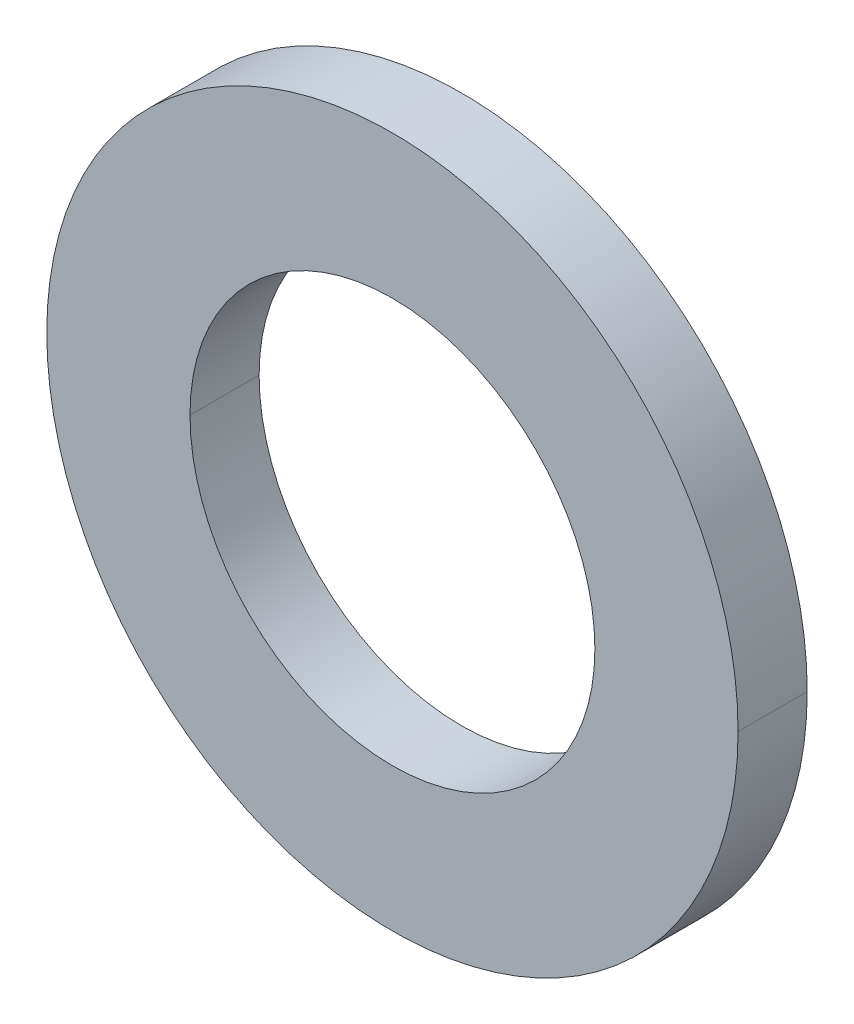
ISO-10303-21;
HEADER;
FILE_DESCRIPTION(('STEP AP214'),'2;1');
FILE_NAME('part.step','',(''),(''),'','','');
FILE_SCHEMA(('AUTOMOTIVE_DESIGN { 1 0 10303 214 1 1 1 1 }'));
ENDSEC;
DATA;
#1=APPLICATION_CONTEXT('core data for automotive mechanical design processes');
#2=APPLICATION_PROTOCOL_DEFINITION('international standard','automotive_design',2000,#1);
#3=PRODUCT_CONTEXT('',#1,'mechanical');
#4=PRODUCT('Part','Part','',(#3));
#5=PRODUCT_RELATED_PRODUCT_CATEGORY('part','',(#4));
#6=PRODUCT_DEFINITION_FORMATION('','',#4);
#7=PRODUCT_DEFINITION_CONTEXT('part definition',#1,'design');
#8=PRODUCT_DEFINITION('design','',#6,#7);
#9=PRODUCT_DEFINITION_SHAPE('','',#8);
#10=(LENGTH_UNIT() NAMED_UNIT(*) SI_UNIT(.MILLI.,.METRE.));
#11=(NAMED_UNIT(*) PLANE_ANGLE_UNIT() SI_UNIT($,.RADIAN.));
#12=(NAMED_UNIT(*) SI_UNIT($,.STERADIAN.) SOLID_ANGLE_UNIT());
#13=UNCERTAINTY_MEASURE_WITH_UNIT(LENGTH_MEASURE(1.E-05),#10,'distance_accuracy_value','');
#14=(GEOMETRIC_REPRESENTATION_CONTEXT(3) GLOBAL_UNCERTAINTY_ASSIGNED_CONTEXT((#13)) GLOBAL_UNIT_ASSIGNED_CONTEXT((#10,
#11,#12)) REPRESENTATION_CONTEXT('',''));
#15=CARTESIAN_POINT('',(0.,0.,0.));
#16=DIRECTION('',(0.,0.,1.));
#17=DIRECTION('',(1.,0.,0.));
#18=AXIS2_PLACEMENT_3D('',#15,#16,#17);
#19=CARTESIAN_POINT('',(0.,0.,0.));
#20=DIRECTION('',(0.,0.,1.));
#21=DIRECTION('',(1.,0.,0.));
#22=AXIS2_PLACEMENT_3D('',#19,#20,#21);
#23=PLANE('',#22);
#24=CARTESIAN_POINT('',(0.,0.,0.));
#25=DIRECTION('',(0.,0.,-1.));
#26=DIRECTION('',(-1.,0.,0.));
#27=AXIS2_PLACEMENT_3D('',#24,#25,#26);
#28=CIRCLE('',#27,2.05);
#29=CARTESIAN_POINT('',(2.05,0.,0.));
#30=VERTEX_POINT('',#29);
#31=CARTESIAN_POINT('',(-2.05,0.,0.));
#32=VERTEX_POINT('',#31);
#33=EDGE_CURVE('E82',#30,#32,#28,.F.);
#34=ORIENTED_EDGE('',*,*,#33,.T.);
#35=CARTESIAN_POINT('',(0.,0.,0.));
#36=DIRECTION('',(0.,0.,-1.));
#37=DIRECTION('',(-1.,0.,0.));
#38=AXIS2_PLACEMENT_3D('',#35,#36,#37);
#39=CIRCLE('',#38,2.05);
#40=EDGE_CURVE('E79',#32,#30,#39,.F.);
#41=ORIENTED_EDGE('',*,*,#40,.T.);
#42=EDGE_LOOP('',(#34,#41));
#43=FACE_BOUND('',#42,.T.);
#44=CARTESIAN_POINT('',(0.,0.,0.));
#45=DIRECTION('',(0.,0.,-1.));
#46=DIRECTION('',(-1.,0.,0.));
#47=AXIS2_PLACEMENT_3D('',#44,#45,#46);
#48=CIRCLE('',#47,3.5);
#49=CARTESIAN_POINT('',(-3.5,0.,0.));
#50=VERTEX_POINT('',#49);
#51=CARTESIAN_POINT('',(3.5,0.,0.));
#52=VERTEX_POINT('',#51);
#53=EDGE_CURVE('E20',#50,#52,#48,.F.);
#54=ORIENTED_EDGE('',*,*,#53,.F.);
#55=CARTESIAN_POINT('',(0.,0.,0.));
#56=DIRECTION('',(0.,0.,-1.));
#57=DIRECTION('',(-1.,0.,0.));
#58=AXIS2_PLACEMENT_3D('',#55,#56,#57);
#59=CIRCLE('',#58,3.5);
#60=EDGE_CURVE('E64',#52,#50,#59,.F.);
#61=ORIENTED_EDGE('',*,*,#60,.F.);
#62=EDGE_LOOP('',(#54,#61));
#63=FACE_BOUND('',#62,.T.);
#64=ADVANCED_FACE('F17',(#43,#63),#23,.F.);
#65=CARTESIAN_POINT('',(0.,0.,0.7));
#66=DIRECTION('',(0.,0.,-1.));
#67=DIRECTION('',(-1.,0.,0.));
#68=AXIS2_PLACEMENT_3D('',#65,#66,#67);
#69=CYLINDRICAL_SURFACE('',#68,3.5);
#70=DIRECTION('',(0.,0.,-1.));
#71=VECTOR('',#70,1.);
#72=CARTESIAN_POINT('',(3.5,0.,0.7));
#73=LINE('',#72,#71);
#74=CARTESIAN_POINT('',(3.5,0.,0.7));
#75=VERTEX_POINT('',#74);
#76=EDGE_CURVE('E59',#75,#52,#73,.T.);
#77=ORIENTED_EDGE('',*,*,#76,.F.);
#78=CARTESIAN_POINT('',(0.,0.,0.7));
#79=DIRECTION('',(0.,0.,-1.));
#80=DIRECTION('',(-1.,0.,0.));
#81=AXIS2_PLACEMENT_3D('',#78,#79,#80);
#82=CIRCLE('',#81,3.5);
#83=CARTESIAN_POINT('',(-3.5,0.,0.7));
#84=VERTEX_POINT('',#83);
#85=EDGE_CURVE('E77',#84,#75,#82,.F.);
#86=ORIENTED_EDGE('',*,*,#85,.F.);
#87=DIRECTION('',(0.,0.,-1.));
#88=VECTOR('',#87,1.);
#89=CARTESIAN_POINT('',(-3.5,0.,0.7));
#90=LINE('',#89,#88);
#91=EDGE_CURVE('E62',#50,#84,#90,.F.);
#92=ORIENTED_EDGE('',*,*,#91,.F.);
#93=ORIENTED_EDGE('',*,*,#53,.T.);
#94=EDGE_LOOP('',(#77,#86,#92,#93));
#95=FACE_BOUND('',#94,.T.);
#96=ADVANCED_FACE('F57',(#95),#69,.T.);
#97=CARTESIAN_POINT('',(0.,0.,0.7));
#98=DIRECTION('',(0.,0.,-1.));
#99=DIRECTION('',(-1.,0.,0.));
#100=AXIS2_PLACEMENT_3D('',#97,#98,#99);
#101=CYLINDRICAL_SURFACE('',#100,3.5);
#102=ORIENTED_EDGE('',*,*,#91,.T.);
#103=CARTESIAN_POINT('',(0.,0.,0.7));
#104=DIRECTION('',(0.,0.,-1.));
#105=DIRECTION('',(-1.,0.,0.));
#106=AXIS2_PLACEMENT_3D('',#103,#104,#105);
#107=CIRCLE('',#106,3.5);
#108=EDGE_CURVE('E68',#75,#84,#107,.F.);
#109=ORIENTED_EDGE('',*,*,#108,.F.);
#110=ORIENTED_EDGE('',*,*,#76,.T.);
#111=ORIENTED_EDGE('',*,*,#60,.T.);
#112=EDGE_LOOP('',(#102,#109,#110,#111));
#113=FACE_BOUND('',#112,.T.);
#114=ADVANCED_FACE('F66',(#113),#101,.T.);
#115=CARTESIAN_POINT('',(0.,0.,0.7));
#116=DIRECTION('',(0.,0.,-1.));
#117=DIRECTION('',(-1.,0.,0.));
#118=AXIS2_PLACEMENT_3D('',#115,#116,#117);
#119=CYLINDRICAL_SURFACE('',#118,2.05);
#120=ORIENTED_EDGE('',*,*,#33,.F.);
#121=DIRECTION('',(0.,0.,-1.));
#122=VECTOR('',#121,1.);
#123=CARTESIAN_POINT('',(2.05,0.,0.7));
#124=LINE('',#123,#122);
#125=CARTESIAN_POINT('',(2.05,0.,0.7));
#126=VERTEX_POINT('',#125);
#127=EDGE_CURVE('E35',#30,#126,#124,.F.);
#128=ORIENTED_EDGE('',*,*,#127,.T.);
#129=CARTESIAN_POINT('',(0.,0.,0.7));
#130=DIRECTION('',(0.,0.,-1.));
#131=DIRECTION('',(-1.,0.,0.));
#132=AXIS2_PLACEMENT_3D('',#129,#130,#131);
#133=CIRCLE('',#132,2.05);
#134=CARTESIAN_POINT('',(-2.05,0.,0.7));
#135=VERTEX_POINT('',#134);
#136=EDGE_CURVE('E26',#135,#126,#133,.T.);
#137=ORIENTED_EDGE('',*,*,#136,.F.);
#138=DIRECTION('',(0.,0.,-1.));
#139=VECTOR('',#138,1.);
#140=CARTESIAN_POINT('',(-2.05,0.,0.7));
#141=LINE('',#140,#139);
#142=EDGE_CURVE('E81',#135,#32,#141,.T.);
#143=ORIENTED_EDGE('',*,*,#142,.T.);
#144=EDGE_LOOP('',(#120,#128,#137,#143));
#145=FACE_BOUND('',#144,.T.);
#146=ADVANCED_FACE('F95',(#145),#119,.F.);
#147=CARTESIAN_POINT('',(0.,0.,0.7));
#148=DIRECTION('',(0.,0.,-1.));
#149=DIRECTION('',(-1.,0.,0.));
#150=AXIS2_PLACEMENT_3D('',#147,#148,#149);
#151=CYLINDRICAL_SURFACE('',#150,2.05);
#152=ORIENTED_EDGE('',*,*,#40,.F.);
#153=ORIENTED_EDGE('',*,*,#142,.F.);
#154=CARTESIAN_POINT('',(0.,0.,0.7));
#155=DIRECTION('',(0.,0.,-1.));
#156=DIRECTION('',(-1.,0.,0.));
#157=AXIS2_PLACEMENT_3D('',#154,#155,#156);
#158=CIRCLE('',#157,2.05);
#159=EDGE_CURVE('E11',#126,#135,#158,.T.);
#160=ORIENTED_EDGE('',*,*,#159,.F.);
#161=ORIENTED_EDGE('',*,*,#127,.F.);
#162=EDGE_LOOP('',(#152,#153,#160,#161));
#163=FACE_BOUND('',#162,.T.);
#164=ADVANCED_FACE('F88',(#163),#151,.F.);
#165=CARTESIAN_POINT('',(0.,0.,0.7));
#166=DIRECTION('',(0.,0.,1.));
#167=DIRECTION('',(1.,0.,0.));
#168=AXIS2_PLACEMENT_3D('',#165,#166,#167);
#169=PLANE('',#168);
#170=ORIENTED_EDGE('',*,*,#136,.T.);
#171=ORIENTED_EDGE('',*,*,#159,.T.);
#172=EDGE_LOOP('',(#170,#171));
#173=FACE_BOUND('',#172,.T.);
#174=ORIENTED_EDGE('',*,*,#85,.T.);
#175=ORIENTED_EDGE('',*,*,#108,.T.);
#176=EDGE_LOOP('',(#174,#175));
#177=FACE_BOUND('',#176,.T.);
#178=ADVANCED_FACE('F86',(#173,#177),#169,.T.);
#179=CLOSED_SHELL('',(#64,#96,#114,#146,#164,#178));
#180=MANIFOLD_SOLID_BREP('B1',#179);
#181=ADVANCED_BREP_SHAPE_REPRESENTATION('',(#18,#180),#14);
#182=SHAPE_DEFINITION_REPRESENTATION(#9,#181);
ENDSEC;
END-ISO-10303-21;
